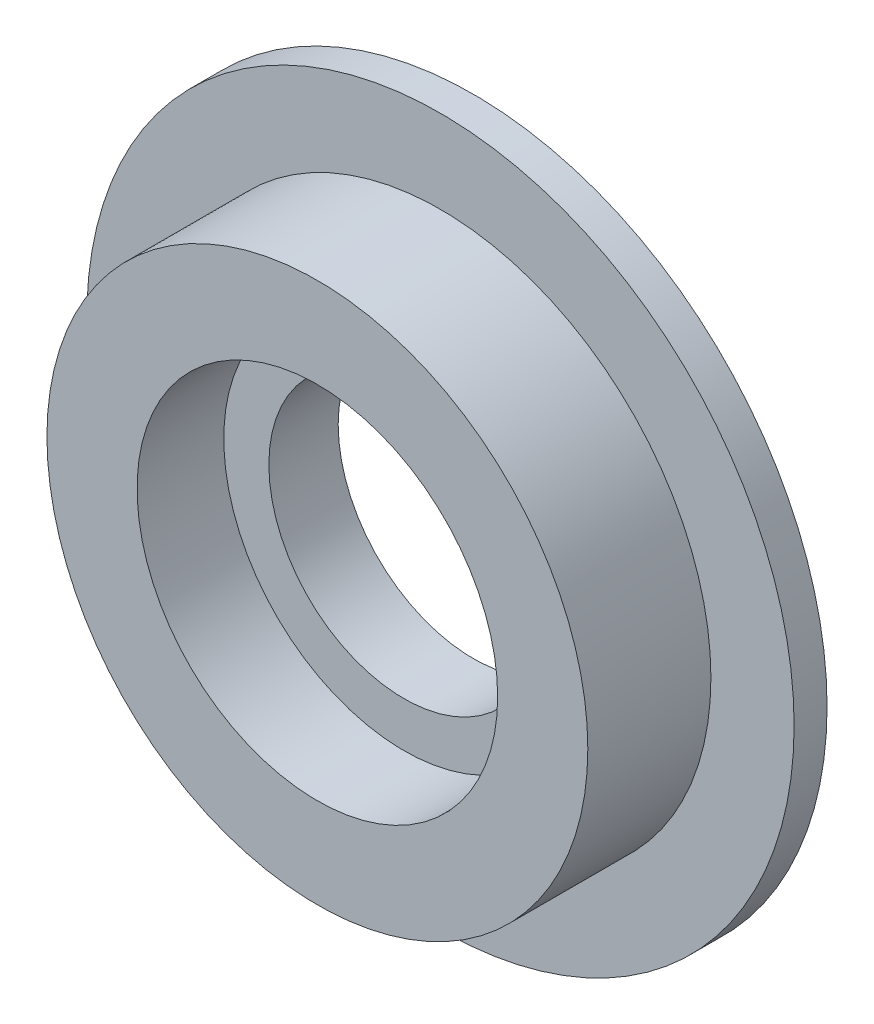
ISO-10303-21;
HEADER;
FILE_DESCRIPTION(('STEP AP214'),'2;1');
FILE_NAME('part.step','',(''),(''),'','','');
FILE_SCHEMA(('AUTOMOTIVE_DESIGN { 1 0 10303 214 1 1 1 1 }'));
ENDSEC;
DATA;
#1=APPLICATION_CONTEXT('core data for automotive mechanical design processes');
#2=APPLICATION_PROTOCOL_DEFINITION('international standard','automotive_design',2000,#1);
#3=PRODUCT_CONTEXT('',#1,'mechanical');
#4=PRODUCT('Part','Part','',(#3));
#5=PRODUCT_RELATED_PRODUCT_CATEGORY('part','',(#4));
#6=PRODUCT_DEFINITION_FORMATION('','',#4);
#7=PRODUCT_DEFINITION_CONTEXT('part definition',#1,'design');
#8=PRODUCT_DEFINITION('design','',#6,#7);
#9=PRODUCT_DEFINITION_SHAPE('','',#8);
#10=(LENGTH_UNIT() NAMED_UNIT(*) SI_UNIT(.MILLI.,.METRE.));
#11=(NAMED_UNIT(*) PLANE_ANGLE_UNIT() SI_UNIT($,.RADIAN.));
#12=(NAMED_UNIT(*) SI_UNIT($,.STERADIAN.) SOLID_ANGLE_UNIT());
#13=UNCERTAINTY_MEASURE_WITH_UNIT(LENGTH_MEASURE(1.E-05),#10,'distance_accuracy_value','');
#14=(GEOMETRIC_REPRESENTATION_CONTEXT(3) GLOBAL_UNCERTAINTY_ASSIGNED_CONTEXT((#13)) GLOBAL_UNIT_ASSIGNED_CONTEXT((#10,
#11,#12)) REPRESENTATION_CONTEXT('',''));
#15=CARTESIAN_POINT('',(0.,0.,0.));
#16=DIRECTION('',(0.,0.,1.));
#17=DIRECTION('',(1.,0.,0.));
#18=AXIS2_PLACEMENT_3D('',#15,#16,#17);
#19=CARTESIAN_POINT('',(0.,0.,0.95));
#20=DIRECTION('',(0.,0.,1.));
#21=DIRECTION('',(1.,0.,0.));
#22=AXIS2_PLACEMENT_3D('',#19,#20,#21);
#23=PLANE('',#22);
#24=CARTESIAN_POINT('',(0.,0.,0.95));
#25=DIRECTION('',(0.,0.,1.));
#26=DIRECTION('',(1.,0.,0.));
#27=AXIS2_PLACEMENT_3D('',#24,#25,#26);
#28=CIRCLE('',#27,10.2);
#29=CARTESIAN_POINT('',(10.2,0.,0.95));
#30=VERTEX_POINT('',#29);
#31=EDGE_CURVE('E39',#30,#30,#28,.T.);
#32=ORIENTED_EDGE('',*,*,#31,.T.);
#33=EDGE_LOOP('',(#32));
#34=FACE_BOUND('',#33,.T.);
#35=CARTESIAN_POINT('',(0.,0.,0.95));
#36=DIRECTION('',(0.,0.,1.));
#37=DIRECTION('',(1.,0.,0.));
#38=AXIS2_PLACEMENT_3D('',#35,#36,#37);
#39=CIRCLE('',#38,7.8);
#40=CARTESIAN_POINT('',(-7.8,0.,0.95));
#41=VERTEX_POINT('',#40);
#42=EDGE_CURVE('E46',#41,#41,#39,.T.);
#43=ORIENTED_EDGE('',*,*,#42,.F.);
#44=EDGE_LOOP('',(#43));
#45=FACE_BOUND('',#44,.T.);
#46=ADVANCED_FACE('F31',(#34,#45),#23,.T.);
#47=CARTESIAN_POINT('',(0.,0.,0.));
#48=DIRECTION('',(0.,0.,1.));
#49=DIRECTION('',(1.,0.,0.));
#50=AXIS2_PLACEMENT_3D('',#47,#48,#49);
#51=CYLINDRICAL_SURFACE('',#50,10.2);
#52=CARTESIAN_POINT('',(0.,0.,0.));
#53=DIRECTION('',(0.,0.,1.));
#54=DIRECTION('',(1.,0.,0.));
#55=AXIS2_PLACEMENT_3D('',#52,#53,#54);
#56=CIRCLE('',#55,10.2);
#57=CARTESIAN_POINT('',(10.2,0.,0.));
#58=VERTEX_POINT('',#57);
#59=EDGE_CURVE('E10',#58,#58,#56,.T.);
#60=CARTESIAN_POINT('',(10.2,0.,0.));
#61=CARTESIAN_POINT('',(10.2,0.,0.00989583333333332));
#62=CARTESIAN_POINT('',(10.2,0.,0.0197916666666667));
#63=CARTESIAN_POINT('',(10.2,0.,0.0395833333333333));
#64=CARTESIAN_POINT('',(10.2,0.,0.0494791666666667));
#65=CARTESIAN_POINT('',(10.2,0.,0.0692708333333333));
#66=CARTESIAN_POINT('',(10.2,0.,0.0791666666666667));
#67=CARTESIAN_POINT('',(10.2,0.,0.0989583333333333));
#68=CARTESIAN_POINT('',(10.2,0.,0.108854166666667));
#69=CARTESIAN_POINT('',(10.2,0.,0.128645833333333));
#70=CARTESIAN_POINT('',(10.2,0.,0.138541666666667));
#71=CARTESIAN_POINT('',(10.2,0.,0.158333333333333));
#72=CARTESIAN_POINT('',(10.2,0.,0.168229166666667));
#73=CARTESIAN_POINT('',(10.2,0.,0.188020833333333));
#74=CARTESIAN_POINT('',(10.2,0.,0.197916666666667));
#75=CARTESIAN_POINT('',(10.2,0.,0.217708333333333));
#76=CARTESIAN_POINT('',(10.2,0.,0.227604166666667));
#77=CARTESIAN_POINT('',(10.2,0.,0.247395833333333));
#78=CARTESIAN_POINT('',(10.2,0.,0.257291666666667));
#79=CARTESIAN_POINT('',(10.2,0.,0.277083333333333));
#80=CARTESIAN_POINT('',(10.2,0.,0.286979166666667));
#81=CARTESIAN_POINT('',(10.2,0.,0.306770833333333));
#82=CARTESIAN_POINT('',(10.2,0.,0.316666666666667));
#83=CARTESIAN_POINT('',(10.2,0.,0.336458333333333));
#84=CARTESIAN_POINT('',(10.2,0.,0.346354166666667));
#85=CARTESIAN_POINT('',(10.2,0.,0.366145833333333));
#86=CARTESIAN_POINT('',(10.2,0.,0.376041666666667));
#87=CARTESIAN_POINT('',(10.2,0.,0.395833333333333));
#88=CARTESIAN_POINT('',(10.2,0.,0.405729166666667));
#89=CARTESIAN_POINT('',(10.2,0.,0.425520833333333));
#90=CARTESIAN_POINT('',(10.2,0.,0.435416666666667));
#91=CARTESIAN_POINT('',(10.2,0.,0.455208333333333));
#92=CARTESIAN_POINT('',(10.2,0.,0.465104166666667));
#93=CARTESIAN_POINT('',(10.2,0.,0.484895833333333));
#94=CARTESIAN_POINT('',(10.2,0.,0.494791666666667));
#95=CARTESIAN_POINT('',(10.2,0.,0.514583333333333));
#96=CARTESIAN_POINT('',(10.2,0.,0.524479166666667));
#97=CARTESIAN_POINT('',(10.2,0.,0.544270833333333));
#98=CARTESIAN_POINT('',(10.2,0.,0.554166666666667));
#99=CARTESIAN_POINT('',(10.2,0.,0.573958333333333));
#100=CARTESIAN_POINT('',(10.2,0.,0.583854166666667));
#101=CARTESIAN_POINT('',(10.2,0.,0.603645833333333));
#102=CARTESIAN_POINT('',(10.2,0.,0.613541666666667));
#103=CARTESIAN_POINT('',(10.2,0.,0.633333333333333));
#104=CARTESIAN_POINT('',(10.2,0.,0.643229166666667));
#105=CARTESIAN_POINT('',(10.2,0.,0.663020833333333));
#106=CARTESIAN_POINT('',(10.2,0.,0.672916666666667));
#107=CARTESIAN_POINT('',(10.2,0.,0.692708333333333));
#108=CARTESIAN_POINT('',(10.2,0.,0.702604166666667));
#109=CARTESIAN_POINT('',(10.2,0.,0.722395833333333));
#110=CARTESIAN_POINT('',(10.2,0.,0.732291666666667));
#111=CARTESIAN_POINT('',(10.2,0.,0.752083333333333));
#112=CARTESIAN_POINT('',(10.2,0.,0.761979166666667));
#113=CARTESIAN_POINT('',(10.2,0.,0.781770833333333));
#114=CARTESIAN_POINT('',(10.2,0.,0.791666666666667));
#115=CARTESIAN_POINT('',(10.2,0.,0.811458333333333));
#116=CARTESIAN_POINT('',(10.2,0.,0.821354166666667));
#117=CARTESIAN_POINT('',(10.2,0.,0.841145833333333));
#118=CARTESIAN_POINT('',(10.2,0.,0.851041666666667));
#119=CARTESIAN_POINT('',(10.2,0.,0.870833333333333));
#120=CARTESIAN_POINT('',(10.2,0.,0.880729166666667));
#121=CARTESIAN_POINT('',(10.2,0.,0.900520833333333));
#122=CARTESIAN_POINT('',(10.2,0.,0.910416666666667));
#123=CARTESIAN_POINT('',(10.2,0.,0.930208333333333));
#124=CARTESIAN_POINT('',(10.2,0.,0.940104166666667));
#125=CARTESIAN_POINT('',(10.2,0.,0.95));
#126=B_SPLINE_CURVE_WITH_KNOTS('',3,(#60,#61,#62,#63,#64,#65,#66,#67,#68,#69,#70,#71,#72,#73,
#74,#75,#76,#77,#78,#79,#80,#81,#82,#83,#84,#85,#86,#87,#88,#89,#90,#91,#92,#93,#94,#95,#96,#97,
#98,#99,#100,#101,#102,#103,#104,#105,#106,#107,#108,#109,#110,#111,#112,#113,#114,#115,#116,
#117,#118,#119,#120,#121,#122,#123,#124,#125),.UNSPECIFIED.,.F.,.F.,(4,2,2,2,2,2,2,2,2,2,2,2,2,
2,2,2,2,2,2,2,2,2,2,2,2,2,2,2,2,2,2,2,4),(0.,0.0296875,0.059375,0.0890625,0.11875,0.1484375,
0.178125,0.2078125,0.2375,0.2671875,0.296875,0.3265625,0.35625,0.3859375,0.415625,0.4453125,
0.475,0.5046875,0.534375,0.5640625,0.59375,0.6234375,0.653125,0.6828125,0.7125,0.7421875,
0.771875,0.8015625,0.83125,0.8609375,0.890625,0.9203125,0.95),.UNSPECIFIED.);
#127=EDGE_CURVE('BSEAM33',#58,#30,#126,.T.);
#128=ORIENTED_EDGE('',*,*,#59,.T.);
#129=ORIENTED_EDGE('',*,*,#31,.F.);
#130=ORIENTED_EDGE('',*,*,#127,.T.);
#131=ORIENTED_EDGE('',*,*,#127,.F.);
#132=EDGE_LOOP('',(#128,#130,#129,#131));
#133=FACE_BOUND('',#132,.T.);
#134=ADVANCED_FACE('F33',(#133),#51,.T.);
#135=CARTESIAN_POINT('',(0.,0.,0.));
#136=DIRECTION('',(0.,0.,1.));
#137=DIRECTION('',(1.,0.,0.));
#138=AXIS2_PLACEMENT_3D('',#135,#136,#137);
#139=PLANE('',#138);
#140=CARTESIAN_POINT('',(0.,0.,0.));
#141=DIRECTION('',(0.,0.,-1.));
#142=DIRECTION('',(-1.,0.,0.));
#143=AXIS2_PLACEMENT_3D('',#140,#141,#142);
#144=CIRCLE('',#143,3.9);
#145=CARTESIAN_POINT('',(-3.9,0.,0.));
#146=VERTEX_POINT('',#145);
#147=EDGE_CURVE('E57',#146,#146,#144,.T.);
#148=ORIENTED_EDGE('',*,*,#147,.F.);
#149=EDGE_LOOP('',(#148));
#150=FACE_BOUND('',#149,.T.);
#151=ORIENTED_EDGE('',*,*,#59,.F.);
#152=EDGE_LOOP('',(#151));
#153=FACE_BOUND('',#152,.T.);
#154=ADVANCED_FACE('F87',(#150,#153),#139,.F.);
#155=CARTESIAN_POINT('',(0.,0.,4.5));
#156=DIRECTION('',(0.,0.,-1.));
#157=DIRECTION('',(-1.,0.,0.));
#158=AXIS2_PLACEMENT_3D('',#155,#156,#157);
#159=CYLINDRICAL_SURFACE('',#158,7.8);
#160=CARTESIAN_POINT('',(0.,0.,4.5));
#161=DIRECTION('',(0.,0.,1.));
#162=DIRECTION('',(1.,0.,0.));
#163=AXIS2_PLACEMENT_3D('',#160,#161,#162);
#164=CIRCLE('',#163,7.8);
#165=CARTESIAN_POINT('',(-7.8,0.,4.5));
#166=VERTEX_POINT('',#165);
#167=EDGE_CURVE('E44',#166,#166,#164,.T.);
#168=CARTESIAN_POINT('',(-7.8,0.,4.5));
#169=CARTESIAN_POINT('',(-7.8,0.,4.46302083333333));
#170=CARTESIAN_POINT('',(-7.8,0.,4.42604166666667));
#171=CARTESIAN_POINT('',(-7.8,0.,4.35208333333333));
#172=CARTESIAN_POINT('',(-7.8,0.,4.31510416666667));
#173=CARTESIAN_POINT('',(-7.8,0.,4.24114583333333));
#174=CARTESIAN_POINT('',(-7.8,0.,4.20416666666667));
#175=CARTESIAN_POINT('',(-7.8,0.,4.13020833333333));
#176=CARTESIAN_POINT('',(-7.8,0.,4.09322916666667));
#177=CARTESIAN_POINT('',(-7.8,0.,4.01927083333333));
#178=CARTESIAN_POINT('',(-7.8,0.,3.98229166666667));
#179=CARTESIAN_POINT('',(-7.8,0.,3.90833333333333));
#180=CARTESIAN_POINT('',(-7.8,0.,3.87135416666667));
#181=CARTESIAN_POINT('',(-7.8,0.,3.79739583333333));
#182=CARTESIAN_POINT('',(-7.8,0.,3.76041666666667));
#183=CARTESIAN_POINT('',(-7.8,0.,3.68645833333333));
#184=CARTESIAN_POINT('',(-7.8,0.,3.64947916666667));
#185=CARTESIAN_POINT('',(-7.8,0.,3.57552083333333));
#186=CARTESIAN_POINT('',(-7.8,0.,3.53854166666667));
#187=CARTESIAN_POINT('',(-7.8,0.,3.46458333333333));
#188=CARTESIAN_POINT('',(-7.8,0.,3.42760416666667));
#189=CARTESIAN_POINT('',(-7.8,0.,3.35364583333333));
#190=CARTESIAN_POINT('',(-7.8,0.,3.31666666666667));
#191=CARTESIAN_POINT('',(-7.8,0.,3.24270833333333));
#192=CARTESIAN_POINT('',(-7.8,0.,3.20572916666667));
#193=CARTESIAN_POINT('',(-7.8,0.,3.13177083333333));
#194=CARTESIAN_POINT('',(-7.8,0.,3.09479166666667));
#195=CARTESIAN_POINT('',(-7.8,0.,3.02083333333333));
#196=CARTESIAN_POINT('',(-7.8,0.,2.98385416666667));
#197=CARTESIAN_POINT('',(-7.8,0.,2.90989583333333));
#198=CARTESIAN_POINT('',(-7.8,0.,2.87291666666667));
#199=CARTESIAN_POINT('',(-7.8,0.,2.79895833333333));
#200=CARTESIAN_POINT('',(-7.8,0.,2.76197916666667));
#201=CARTESIAN_POINT('',(-7.8,0.,2.68802083333333));
#202=CARTESIAN_POINT('',(-7.8,0.,2.65104166666667));
#203=CARTESIAN_POINT('',(-7.8,0.,2.57708333333333));
#204=CARTESIAN_POINT('',(-7.8,0.,2.54010416666667));
#205=CARTESIAN_POINT('',(-7.8,0.,2.46614583333333));
#206=CARTESIAN_POINT('',(-7.8,0.,2.42916666666667));
#207=CARTESIAN_POINT('',(-7.8,0.,2.35520833333333));
#208=CARTESIAN_POINT('',(-7.8,0.,2.31822916666667));
#209=CARTESIAN_POINT('',(-7.8,0.,2.24427083333333));
#210=CARTESIAN_POINT('',(-7.8,0.,2.20729166666667));
#211=CARTESIAN_POINT('',(-7.8,0.,2.13333333333333));
#212=CARTESIAN_POINT('',(-7.8,0.,2.09635416666667));
#213=CARTESIAN_POINT('',(-7.8,0.,2.02239583333333));
#214=CARTESIAN_POINT('',(-7.8,0.,1.98541666666667));
#215=CARTESIAN_POINT('',(-7.8,0.,1.91145833333333));
#216=CARTESIAN_POINT('',(-7.8,0.,1.87447916666667));
#217=CARTESIAN_POINT('',(-7.8,0.,1.80052083333333));
#218=CARTESIAN_POINT('',(-7.8,0.,1.76354166666667));
#219=CARTESIAN_POINT('',(-7.8,0.,1.68958333333333));
#220=CARTESIAN_POINT('',(-7.8,0.,1.65260416666667));
#221=CARTESIAN_POINT('',(-7.8,0.,1.57864583333333));
#222=CARTESIAN_POINT('',(-7.8,0.,1.54166666666667));
#223=CARTESIAN_POINT('',(-7.8,0.,1.46770833333333));
#224=CARTESIAN_POINT('',(-7.8,0.,1.43072916666667));
#225=CARTESIAN_POINT('',(-7.8,0.,1.35677083333333));
#226=CARTESIAN_POINT('',(-7.8,0.,1.31979166666667));
#227=CARTESIAN_POINT('',(-7.8,0.,1.24583333333333));
#228=CARTESIAN_POINT('',(-7.8,0.,1.20885416666667));
#229=CARTESIAN_POINT('',(-7.8,0.,1.13489583333333));
#230=CARTESIAN_POINT('',(-7.8,0.,1.09791666666667));
#231=CARTESIAN_POINT('',(-7.8,0.,1.02395833333333));
#232=CARTESIAN_POINT('',(-7.8,0.,0.986979166666667));
#233=CARTESIAN_POINT('',(-7.8,0.,0.95));
#234=B_SPLINE_CURVE_WITH_KNOTS('',3,(#168,#169,#170,#171,#172,#173,#174,#175,#176,#177,#178,
#179,#180,#181,#182,#183,#184,#185,#186,#187,#188,#189,#190,#191,#192,#193,#194,#195,#196,#197,
#198,#199,#200,#201,#202,#203,#204,#205,#206,#207,#208,#209,#210,#211,#212,#213,#214,#215,#216,
#217,#218,#219,#220,#221,#222,#223,#224,#225,#226,#227,#228,#229,#230,#231,#232,#233),
.UNSPECIFIED.,.F.,.F.,(4,2,2,2,2,2,2,2,2,2,2,2,2,2,2,2,2,2,2,2,2,2,2,2,2,2,2,2,2,2,2,2,4),(0.,
0.1109375,0.221875,0.3328125,0.44375,0.5546875,0.665625,0.776562499999999,0.887499999999999,
0.998437499999999,1.109375,1.2203125,1.33125,1.4421875,1.553125,1.6640625,1.775,1.8859375,
1.996875,2.1078125,2.21875,2.3296875,2.440625,2.5515625,2.6625,2.7734375,2.884375,2.9953125,
3.10625,3.2171875,3.328125,3.4390625,3.55),.UNSPECIFIED.);
#235=EDGE_CURVE('BSEAM81',#166,#41,#234,.T.);
#236=ORIENTED_EDGE('',*,*,#167,.F.);
#237=ORIENTED_EDGE('',*,*,#42,.T.);
#238=ORIENTED_EDGE('',*,*,#235,.T.);
#239=ORIENTED_EDGE('',*,*,#235,.F.);
#240=EDGE_LOOP('',(#236,#238,#237,#239));
#241=FACE_BOUND('',#240,.T.);
#242=ADVANCED_FACE('F81',(#241),#159,.T.);
#243=CARTESIAN_POINT('',(0.,0.,4.5));
#244=DIRECTION('',(0.,0.,1.));
#245=DIRECTION('',(1.,0.,0.));
#246=AXIS2_PLACEMENT_3D('',#243,#244,#245);
#247=PLANE('',#246);
#248=CARTESIAN_POINT('',(0.,0.,4.5));
#249=DIRECTION('',(0.,0.,1.));
#250=DIRECTION('',(1.,0.,0.));
#251=AXIS2_PLACEMENT_3D('',#248,#249,#250);
#252=CIRCLE('',#251,5.2);
#253=CARTESIAN_POINT('',(5.2,0.,4.5));
#254=VERTEX_POINT('',#253);
#255=EDGE_CURVE('E52',#254,#254,#252,.T.);
#256=ORIENTED_EDGE('',*,*,#255,.F.);
#257=EDGE_LOOP('',(#256));
#258=FACE_BOUND('',#257,.T.);
#259=ORIENTED_EDGE('',*,*,#167,.T.);
#260=EDGE_LOOP('',(#259));
#261=FACE_BOUND('',#260,.T.);
#262=ADVANCED_FACE('F75',(#258,#261),#247,.T.);
#263=CARTESIAN_POINT('',(0.,0.,2.));
#264=DIRECTION('',(0.,0.,1.));
#265=DIRECTION('',(1.,0.,0.));
#266=AXIS2_PLACEMENT_3D('',#263,#264,#265);
#267=CYLINDRICAL_SURFACE('',#266,5.2);
#268=CARTESIAN_POINT('',(0.,0.,2.));
#269=DIRECTION('',(0.,0.,1.));
#270=DIRECTION('',(1.,0.,0.));
#271=AXIS2_PLACEMENT_3D('',#268,#269,#270);
#272=CIRCLE('',#271,5.2);
#273=CARTESIAN_POINT('',(5.2,0.,2.));
#274=VERTEX_POINT('',#273);
#275=EDGE_CURVE('E49',#274,#274,#272,.T.);
#276=ORIENTED_EDGE('',*,*,#275,.F.);
#277=EDGE_LOOP('',(#276));
#278=FACE_BOUND('',#277,.T.);
#279=ORIENTED_EDGE('',*,*,#255,.T.);
#280=EDGE_LOOP('',(#279));
#281=FACE_BOUND('',#280,.T.);
#282=ADVANCED_FACE('F69',(#278,#281),#267,.F.);
#283=CARTESIAN_POINT('',(0.,0.,2.));
#284=DIRECTION('',(0.,0.,1.));
#285=DIRECTION('',(1.,0.,0.));
#286=AXIS2_PLACEMENT_3D('',#283,#284,#285);
#287=PLANE('',#286);
#288=CARTESIAN_POINT('',(0.,0.,2.));
#289=DIRECTION('',(0.,0.,1.));
#290=DIRECTION('',(1.,0.,0.));
#291=AXIS2_PLACEMENT_3D('',#288,#289,#290);
#292=CIRCLE('',#291,3.9);
#293=CARTESIAN_POINT('',(3.9,0.,2.));
#294=VERTEX_POINT('',#293);
#295=EDGE_CURVE('E35',#294,#294,#292,.T.);
#296=ORIENTED_EDGE('',*,*,#295,.F.);
#297=EDGE_LOOP('',(#296));
#298=FACE_BOUND('',#297,.T.);
#299=ORIENTED_EDGE('',*,*,#275,.T.);
#300=EDGE_LOOP('',(#299));
#301=FACE_BOUND('',#300,.T.);
#302=ADVANCED_FACE('F66',(#298,#301),#287,.T.);
#303=CARTESIAN_POINT('',(0.,0.,4.5));
#304=DIRECTION('',(0.,0.,-1.));
#305=DIRECTION('',(-1.,0.,0.));
#306=AXIS2_PLACEMENT_3D('',#303,#304,#305);
#307=CYLINDRICAL_SURFACE('',#306,3.9);
#308=ORIENTED_EDGE('',*,*,#295,.T.);
#309=EDGE_LOOP('',(#308));
#310=FACE_BOUND('',#309,.T.);
#311=ORIENTED_EDGE('',*,*,#147,.T.);
#312=EDGE_LOOP('',(#311));
#313=FACE_BOUND('',#312,.T.);
#314=ADVANCED_FACE('F64',(#310,#313),#307,.F.);
#315=CLOSED_SHELL('',(#46,#134,#154,#242,#262,#282,#302,#314));
#316=MANIFOLD_SOLID_BREP('B2',#315);
#317=ADVANCED_BREP_SHAPE_REPRESENTATION('',(#18,#316),#14);
#318=SHAPE_DEFINITION_REPRESENTATION(#9,#317);
ENDSEC;
END-ISO-10303-21;
